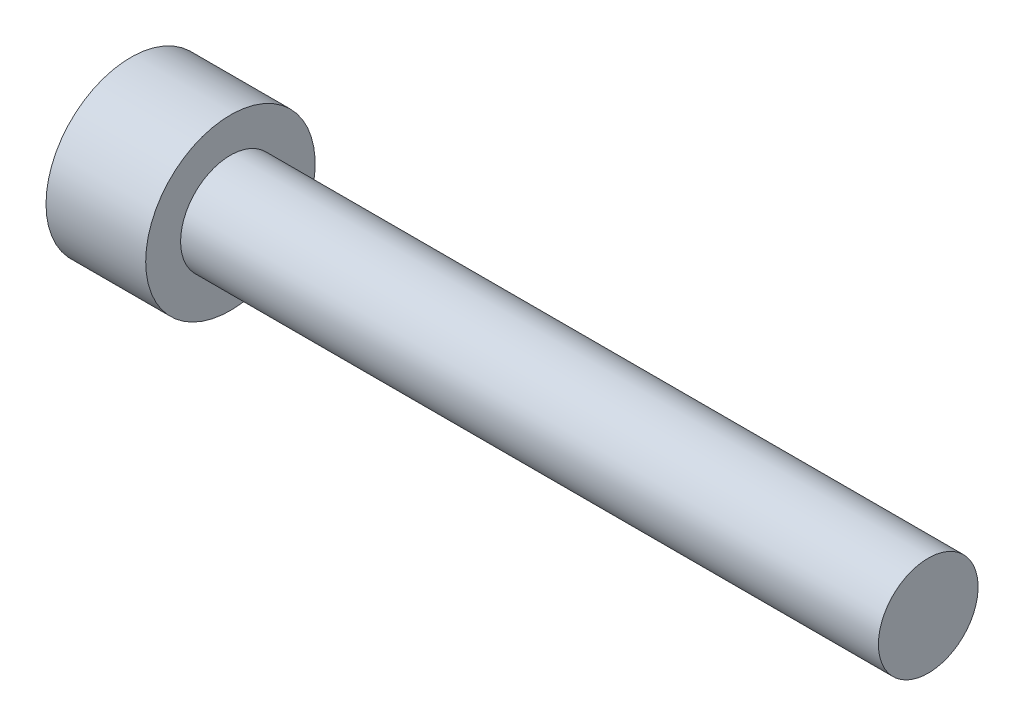
ISO-10303-21;
HEADER;
FILE_DESCRIPTION(('STEP AP214'),'2;1');
FILE_NAME('part.step','',(''),(''),'','','');
FILE_SCHEMA(('AUTOMOTIVE_DESIGN { 1 0 10303 214 1 1 1 1 }'));
ENDSEC;
DATA;
#1=APPLICATION_CONTEXT('core data for automotive mechanical design processes');
#2=APPLICATION_PROTOCOL_DEFINITION('international standard','automotive_design',2000,#1);
#3=PRODUCT_CONTEXT('',#1,'mechanical');
#4=PRODUCT('Part','Part','',(#3));
#5=PRODUCT_RELATED_PRODUCT_CATEGORY('part','',(#4));
#6=PRODUCT_DEFINITION_FORMATION('','',#4);
#7=PRODUCT_DEFINITION_CONTEXT('part definition',#1,'design');
#8=PRODUCT_DEFINITION('design','',#6,#7);
#9=PRODUCT_DEFINITION_SHAPE('','',#8);
#10=(LENGTH_UNIT() NAMED_UNIT(*) SI_UNIT(.MILLI.,.METRE.));
#11=(NAMED_UNIT(*) PLANE_ANGLE_UNIT() SI_UNIT($,.RADIAN.));
#12=(NAMED_UNIT(*) SI_UNIT($,.STERADIAN.) SOLID_ANGLE_UNIT());
#13=UNCERTAINTY_MEASURE_WITH_UNIT(LENGTH_MEASURE(1.E-05),#10,'distance_accuracy_value','');
#14=(GEOMETRIC_REPRESENTATION_CONTEXT(3) GLOBAL_UNCERTAINTY_ASSIGNED_CONTEXT((#13)) GLOBAL_UNIT_ASSIGNED_CONTEXT((#10,
#11,#12)) REPRESENTATION_CONTEXT('',''));
#15=CARTESIAN_POINT('',(0.,0.,0.));
#16=DIRECTION('',(0.,0.,1.));
#17=DIRECTION('',(1.,0.,0.));
#18=AXIS2_PLACEMENT_3D('',#15,#16,#17);
#19=CARTESIAN_POINT('',(-5.,0.,0.));
#20=DIRECTION('',(1.,0.,0.));
#21=DIRECTION('',(0.,0.,-1.));
#22=AXIS2_PLACEMENT_3D('',#19,#20,#21);
#23=PLANE('',#22);
#24=CARTESIAN_POINT('',(-5.,0.,0.));
#25=DIRECTION('',(-1.,0.,0.));
#26=DIRECTION('',(0.,0.,1.));
#27=AXIS2_PLACEMENT_3D('',#24,#25,#26);
#28=CIRCLE('',#27,4.25);
#29=CARTESIAN_POINT('',(-5.,0.,4.25));
#30=VERTEX_POINT('',#29);
#31=EDGE_CURVE('E11',#30,#30,#28,.T.);
#32=ORIENTED_EDGE('',*,*,#31,.T.);
#33=EDGE_LOOP('',(#32));
#34=FACE_BOUND('',#33,.T.);
#35=DIRECTION('',(0.,0.866025403784439,-0.5));
#36=VECTOR('',#35,1.);
#37=CARTESIAN_POINT('',(-5.,-2.,-1.15470053837925));
#38=LINE('',#37,#36);
#39=CARTESIAN_POINT('',(-5.,-2.,-1.15470053837925));
#40=VERTEX_POINT('',#39);
#41=CARTESIAN_POINT('',(-5.,0.,-2.3094010767585));
#42=VERTEX_POINT('',#41);
#43=EDGE_CURVE('E54',#40,#42,#38,.T.);
#44=ORIENTED_EDGE('',*,*,#43,.T.);
#45=DIRECTION('',(0.,0.866025403784439,0.5));
#46=VECTOR('',#45,1.);
#47=CARTESIAN_POINT('',(-5.,0.,-2.3094010767585));
#48=LINE('',#47,#46);
#49=CARTESIAN_POINT('',(-5.,2.,-1.15470053837925));
#50=VERTEX_POINT('',#49);
#51=EDGE_CURVE('E129',#42,#50,#48,.T.);
#52=ORIENTED_EDGE('',*,*,#51,.T.);
#53=DIRECTION('',(0.,0.,1.));
#54=VECTOR('',#53,1.);
#55=CARTESIAN_POINT('',(-5.,2.,-1.15470053837925));
#56=LINE('',#55,#54);
#57=CARTESIAN_POINT('',(-5.,2.,1.15470053837925));
#58=VERTEX_POINT('',#57);
#59=EDGE_CURVE('E128',#50,#58,#56,.T.);
#60=ORIENTED_EDGE('',*,*,#59,.T.);
#61=DIRECTION('',(0.,-0.866025403784438,0.5));
#62=VECTOR('',#61,1.);
#63=CARTESIAN_POINT('',(-5.,2.,1.15470053837925));
#64=LINE('',#63,#62);
#65=CARTESIAN_POINT('',(-5.,0.,2.3094010767585));
#66=VERTEX_POINT('',#65);
#67=EDGE_CURVE('E135',#58,#66,#64,.T.);
#68=ORIENTED_EDGE('',*,*,#67,.T.);
#69=DIRECTION('',(0.,-0.866025403784439,-0.5));
#70=VECTOR('',#69,1.);
#71=CARTESIAN_POINT('',(-5.,0.,2.3094010767585));
#72=LINE('',#71,#70);
#73=CARTESIAN_POINT('',(-5.,-2.,1.15470053837925));
#74=VERTEX_POINT('',#73);
#75=EDGE_CURVE('E116',#66,#74,#72,.T.);
#76=ORIENTED_EDGE('',*,*,#75,.T.);
#77=DIRECTION('',(0.,0.,-1.));
#78=VECTOR('',#77,1.);
#79=CARTESIAN_POINT('',(-5.,-2.,1.15470053837925));
#80=LINE('',#79,#78);
#81=EDGE_CURVE('E131',#74,#40,#80,.T.);
#82=ORIENTED_EDGE('',*,*,#81,.T.);
#83=EDGE_LOOP('',(#44,#52,#60,#68,#76,#82));
#84=FACE_BOUND('',#83,.T.);
#85=ADVANCED_FACE('F41',(#34,#84),#23,.F.);
#86=CARTESIAN_POINT('',(-1000.,0.,0.));
#87=DIRECTION('',(-1.,0.,0.));
#88=DIRECTION('',(0.,0.,1.));
#89=AXIS2_PLACEMENT_3D('',#86,#87,#88);
#90=CYLINDRICAL_SURFACE('',#89,4.25);
#91=ORIENTED_EDGE('',*,*,#31,.F.);
#92=EDGE_LOOP('',(#91));
#93=FACE_BOUND('',#92,.T.);
#94=CARTESIAN_POINT('',(0.,0.,0.));
#95=DIRECTION('',(-1.,0.,0.));
#96=DIRECTION('',(0.,0.,1.));
#97=AXIS2_PLACEMENT_3D('',#94,#95,#96);
#98=CIRCLE('',#97,4.25);
#99=CARTESIAN_POINT('',(0.,0.,4.25));
#100=VERTEX_POINT('',#99);
#101=EDGE_CURVE('E48',#100,#100,#98,.T.);
#102=ORIENTED_EDGE('',*,*,#101,.T.);
#103=EDGE_LOOP('',(#102));
#104=FACE_BOUND('',#103,.T.);
#105=ADVANCED_FACE('F154',(#93,#104),#90,.T.);
#106=CARTESIAN_POINT('',(0.,4.25,0.));
#107=DIRECTION('',(-1.,0.,0.));
#108=DIRECTION('',(0.,0.,1.));
#109=AXIS2_PLACEMENT_3D('',#106,#107,#108);
#110=PLANE('',#109);
#111=ORIENTED_EDGE('',*,*,#101,.F.);
#112=EDGE_LOOP('',(#111));
#113=FACE_BOUND('',#112,.T.);
#114=CARTESIAN_POINT('',(0.,0.,0.));
#115=DIRECTION('',(-1.,0.,0.));
#116=DIRECTION('',(0.,0.,1.));
#117=AXIS2_PLACEMENT_3D('',#114,#115,#116);
#118=CIRCLE('',#117,2.5);
#119=CARTESIAN_POINT('',(0.,0.,2.5));
#120=VERTEX_POINT('',#119);
#121=EDGE_CURVE('E148',#120,#120,#118,.T.);
#122=ORIENTED_EDGE('',*,*,#121,.T.);
#123=EDGE_LOOP('',(#122));
#124=FACE_BOUND('',#123,.T.);
#125=ADVANCED_FACE('F158',(#113,#124),#110,.F.);
#126=CARTESIAN_POINT('',(-1000.,0.,0.));
#127=DIRECTION('',(-1.,0.,0.));
#128=DIRECTION('',(0.,0.,1.));
#129=AXIS2_PLACEMENT_3D('',#126,#127,#128);
#130=CYLINDRICAL_SURFACE('',#129,2.5);
#131=ORIENTED_EDGE('',*,*,#121,.F.);
#132=EDGE_LOOP('',(#131));
#133=FACE_BOUND('',#132,.T.);
#134=CARTESIAN_POINT('',(34.9999999999999,0.,0.));
#135=DIRECTION('',(-1.,0.,0.));
#136=DIRECTION('',(0.,0.,1.));
#137=AXIS2_PLACEMENT_3D('',#134,#135,#136);
#138=CIRCLE('',#137,2.5);
#139=CARTESIAN_POINT('',(34.9999999999999,0.,2.5));
#140=VERTEX_POINT('',#139);
#141=EDGE_CURVE('E149',#140,#140,#138,.T.);
#142=ORIENTED_EDGE('',*,*,#141,.T.);
#143=EDGE_LOOP('',(#142));
#144=FACE_BOUND('',#143,.T.);
#145=ADVANCED_FACE('F157',(#133,#144),#130,.T.);
#146=CARTESIAN_POINT('',(35.,2.5,0.));
#147=DIRECTION('',(-1.,0.,0.));
#148=DIRECTION('',(0.,0.,1.));
#149=AXIS2_PLACEMENT_3D('',#146,#147,#148);
#150=PLANE('',#149);
#151=ORIENTED_EDGE('',*,*,#141,.F.);
#152=EDGE_LOOP('',(#151));
#153=FACE_BOUND('',#152,.T.);
#154=ADVANCED_FACE('F164',(#153),#150,.F.);
#155=CARTESIAN_POINT('',(-2.5,-2.,-1.15470053837925));
#156=DIRECTION('',(0.,0.5,0.866025403784439));
#157=DIRECTION('',(0.,-0.866025403784439,0.5));
#158=AXIS2_PLACEMENT_3D('',#155,#156,#157);
#159=PLANE('',#158);
#160=ORIENTED_EDGE('',*,*,#43,.F.);
#161=DIRECTION('',(-1.,0.,0.));
#162=VECTOR('',#161,1.);
#163=CARTESIAN_POINT('',(-2.5,-2.,-1.15470053837925));
#164=LINE('',#163,#162);
#165=CARTESIAN_POINT('',(-2.5,-2.,-1.15470053837925));
#166=VERTEX_POINT('',#165);
#167=EDGE_CURVE('E122',#166,#40,#164,.T.);
#168=ORIENTED_EDGE('',*,*,#167,.F.);
#169=DIRECTION('',(0.,0.866025403784439,-0.5));
#170=VECTOR('',#169,1.);
#171=CARTESIAN_POINT('',(-2.5,-2.,-1.15470053837925));
#172=LINE('',#171,#170);
#173=CARTESIAN_POINT('',(-2.5,0.,-2.3094010767585));
#174=VERTEX_POINT('',#173);
#175=EDGE_CURVE('E136',#166,#174,#172,.T.);
#176=ORIENTED_EDGE('',*,*,#175,.T.);
#177=DIRECTION('',(-1.,0.,0.));
#178=VECTOR('',#177,1.);
#179=CARTESIAN_POINT('',(-2.5,0.,-2.3094010767585));
#180=LINE('',#179,#178);
#181=EDGE_CURVE('E144',#174,#42,#180,.T.);
#182=ORIENTED_EDGE('',*,*,#181,.T.);
#183=EDGE_LOOP('',(#160,#168,#176,#182));
#184=FACE_BOUND('',#183,.T.);
#185=ADVANCED_FACE('F167',(#184),#159,.T.);
#186=CARTESIAN_POINT('',(-2.5,0.,-2.3094010767585));
#187=DIRECTION('',(0.,-0.5,0.866025403784439));
#188=DIRECTION('',(0.,-0.866025403784439,-0.5));
#189=AXIS2_PLACEMENT_3D('',#186,#187,#188);
#190=PLANE('',#189);
#191=ORIENTED_EDGE('',*,*,#51,.F.);
#192=ORIENTED_EDGE('',*,*,#181,.F.);
#193=DIRECTION('',(0.,0.866025403784439,0.5));
#194=VECTOR('',#193,1.);
#195=CARTESIAN_POINT('',(-2.5,0.,-2.3094010767585));
#196=LINE('',#195,#194);
#197=CARTESIAN_POINT('',(-2.5,2.,-1.15470053837925));
#198=VERTEX_POINT('',#197);
#199=EDGE_CURVE('E92',#174,#198,#196,.T.);
#200=ORIENTED_EDGE('',*,*,#199,.T.);
#201=DIRECTION('',(-1.,0.,0.));
#202=VECTOR('',#201,1.);
#203=CARTESIAN_POINT('',(-2.5,2.,-1.15470053837925));
#204=LINE('',#203,#202);
#205=EDGE_CURVE('E145',#198,#50,#204,.T.);
#206=ORIENTED_EDGE('',*,*,#205,.T.);
#207=EDGE_LOOP('',(#191,#192,#200,#206));
#208=FACE_BOUND('',#207,.T.);
#209=ADVANCED_FACE('F176',(#208),#190,.T.);
#210=CARTESIAN_POINT('',(-2.5,2.,-1.15470053837925));
#211=DIRECTION('',(0.,-1.,0.));
#212=DIRECTION('',(0.,0.,-1.));
#213=AXIS2_PLACEMENT_3D('',#210,#211,#212);
#214=PLANE('',#213);
#215=ORIENTED_EDGE('',*,*,#59,.F.);
#216=ORIENTED_EDGE('',*,*,#205,.F.);
#217=DIRECTION('',(0.,0.,1.));
#218=VECTOR('',#217,1.);
#219=CARTESIAN_POINT('',(-2.5,2.,-1.15470053837925));
#220=LINE('',#219,#218);
#221=CARTESIAN_POINT('',(-2.5,2.,1.15470053837925));
#222=VERTEX_POINT('',#221);
#223=EDGE_CURVE('E115',#198,#222,#220,.T.);
#224=ORIENTED_EDGE('',*,*,#223,.T.);
#225=DIRECTION('',(-1.,0.,0.));
#226=VECTOR('',#225,1.);
#227=CARTESIAN_POINT('',(-2.5,2.,1.15470053837925));
#228=LINE('',#227,#226);
#229=EDGE_CURVE('E107',#222,#58,#228,.T.);
#230=ORIENTED_EDGE('',*,*,#229,.T.);
#231=EDGE_LOOP('',(#215,#216,#224,#230));
#232=FACE_BOUND('',#231,.T.);
#233=ADVANCED_FACE('F191',(#232),#214,.T.);
#234=CARTESIAN_POINT('',(-2.5,2.,1.15470053837925));
#235=DIRECTION('',(0.,-0.5,-0.866025403784439));
#236=DIRECTION('',(0.,0.866025403784439,-0.5));
#237=AXIS2_PLACEMENT_3D('',#234,#235,#236);
#238=PLANE('',#237);
#239=ORIENTED_EDGE('',*,*,#67,.F.);
#240=ORIENTED_EDGE('',*,*,#229,.F.);
#241=DIRECTION('',(0.,-0.866025403784438,0.5));
#242=VECTOR('',#241,1.);
#243=CARTESIAN_POINT('',(-2.5,2.,1.15470053837925));
#244=LINE('',#243,#242);
#245=CARTESIAN_POINT('',(-2.5,0.,2.3094010767585));
#246=VERTEX_POINT('',#245);
#247=EDGE_CURVE('E104',#222,#246,#244,.T.);
#248=ORIENTED_EDGE('',*,*,#247,.T.);
#249=DIRECTION('',(-1.,0.,0.));
#250=VECTOR('',#249,1.);
#251=CARTESIAN_POINT('',(-2.5,0.,2.3094010767585));
#252=LINE('',#251,#250);
#253=EDGE_CURVE('E108',#246,#66,#252,.T.);
#254=ORIENTED_EDGE('',*,*,#253,.T.);
#255=EDGE_LOOP('',(#239,#240,#248,#254));
#256=FACE_BOUND('',#255,.T.);
#257=ADVANCED_FACE('F110',(#256),#238,.T.);
#258=CARTESIAN_POINT('',(-2.5,0.,2.3094010767585));
#259=DIRECTION('',(0.,0.5,-0.866025403784439));
#260=DIRECTION('',(0.,0.866025403784439,0.5));
#261=AXIS2_PLACEMENT_3D('',#258,#259,#260);
#262=PLANE('',#261);
#263=ORIENTED_EDGE('',*,*,#75,.F.);
#264=ORIENTED_EDGE('',*,*,#253,.F.);
#265=DIRECTION('',(0.,-0.866025403784439,-0.5));
#266=VECTOR('',#265,1.);
#267=CARTESIAN_POINT('',(-2.5,0.,2.3094010767585));
#268=LINE('',#267,#266);
#269=CARTESIAN_POINT('',(-2.5,-2.,1.15470053837925));
#270=VERTEX_POINT('',#269);
#271=EDGE_CURVE('E111',#246,#270,#268,.T.);
#272=ORIENTED_EDGE('',*,*,#271,.T.);
#273=DIRECTION('',(-1.,0.,0.));
#274=VECTOR('',#273,1.);
#275=CARTESIAN_POINT('',(-2.5,-2.,1.15470053837925));
#276=LINE('',#275,#274);
#277=EDGE_CURVE('E82',#270,#74,#276,.T.);
#278=ORIENTED_EDGE('',*,*,#277,.T.);
#279=EDGE_LOOP('',(#263,#264,#272,#278));
#280=FACE_BOUND('',#279,.T.);
#281=ADVANCED_FACE('F112',(#280),#262,.T.);
#282=CARTESIAN_POINT('',(-2.5,-2.,1.15470053837925));
#283=DIRECTION('',(0.,1.,0.));
#284=DIRECTION('',(0.,0.,1.));
#285=AXIS2_PLACEMENT_3D('',#282,#283,#284);
#286=PLANE('',#285);
#287=ORIENTED_EDGE('',*,*,#81,.F.);
#288=ORIENTED_EDGE('',*,*,#277,.F.);
#289=DIRECTION('',(0.,0.,-1.));
#290=VECTOR('',#289,1.);
#291=CARTESIAN_POINT('',(-2.5,-2.,1.15470053837925));
#292=LINE('',#291,#290);
#293=EDGE_CURVE('E65',#270,#166,#292,.T.);
#294=ORIENTED_EDGE('',*,*,#293,.T.);
#295=ORIENTED_EDGE('',*,*,#167,.T.);
#296=EDGE_LOOP('',(#287,#288,#294,#295));
#297=FACE_BOUND('',#296,.T.);
#298=ADVANCED_FACE('F184',(#297),#286,.T.);
#299=CARTESIAN_POINT('',(-2.5,0.,0.));
#300=DIRECTION('',(1.,0.,0.));
#301=DIRECTION('',(0.,0.,-1.));
#302=AXIS2_PLACEMENT_3D('',#299,#300,#301);
#303=PLANE('',#302);
#304=ORIENTED_EDGE('',*,*,#175,.F.);
#305=ORIENTED_EDGE('',*,*,#293,.F.);
#306=ORIENTED_EDGE('',*,*,#271,.F.);
#307=ORIENTED_EDGE('',*,*,#247,.F.);
#308=ORIENTED_EDGE('',*,*,#223,.F.);
#309=ORIENTED_EDGE('',*,*,#199,.F.);
#310=EDGE_LOOP('',(#304,#305,#306,#307,#308,#309));
#311=FACE_BOUND('',#310,.T.);
#312=ADVANCED_FACE('F118',(#311),#303,.F.);
#313=CLOSED_SHELL('',(#85,#105,#125,#145,#154,#185,#209,#233,#257,#281,#298,#312));
#314=MANIFOLD_SOLID_BREP('B2',#313);
#315=ADVANCED_BREP_SHAPE_REPRESENTATION('',(#18,#314),#14);
#316=SHAPE_DEFINITION_REPRESENTATION(#9,#315);
ENDSEC;
END-ISO-10303-21;
